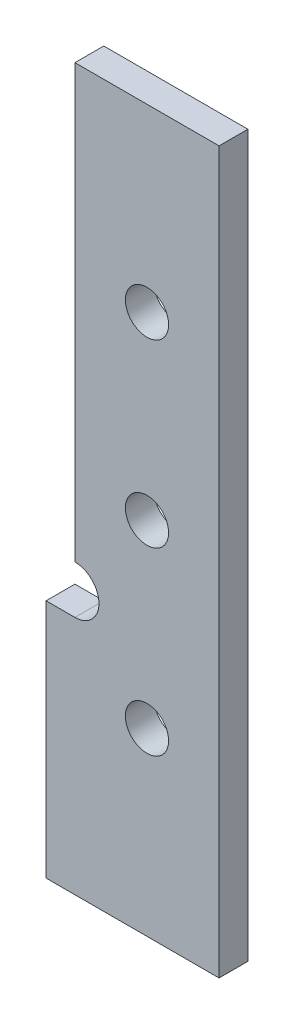
ISO-10303-21;
HEADER;
FILE_DESCRIPTION(('STEP AP214'),'2;1');
FILE_NAME('part.step','',(''),(''),'','','');
FILE_SCHEMA(('AUTOMOTIVE_DESIGN { 1 0 10303 214 1 1 1 1 }'));
ENDSEC;
DATA;
#1=APPLICATION_CONTEXT('core data for automotive mechanical design processes');
#2=APPLICATION_PROTOCOL_DEFINITION('international standard','automotive_design',2000,#1);
#3=PRODUCT_CONTEXT('',#1,'mechanical');
#4=PRODUCT('Part','Part','',(#3));
#5=PRODUCT_RELATED_PRODUCT_CATEGORY('part','',(#4));
#6=PRODUCT_DEFINITION_FORMATION('','',#4);
#7=PRODUCT_DEFINITION_CONTEXT('part definition',#1,'design');
#8=PRODUCT_DEFINITION('design','',#6,#7);
#9=PRODUCT_DEFINITION_SHAPE('','',#8);
#10=(LENGTH_UNIT() NAMED_UNIT(*) SI_UNIT(.MILLI.,.METRE.));
#11=(NAMED_UNIT(*) PLANE_ANGLE_UNIT() SI_UNIT($,.RADIAN.));
#12=(NAMED_UNIT(*) SI_UNIT($,.STERADIAN.) SOLID_ANGLE_UNIT());
#13=UNCERTAINTY_MEASURE_WITH_UNIT(LENGTH_MEASURE(1.E-05),#10,'distance_accuracy_value','');
#14=(GEOMETRIC_REPRESENTATION_CONTEXT(3) GLOBAL_UNCERTAINTY_ASSIGNED_CONTEXT((#13)) GLOBAL_UNIT_ASSIGNED_CONTEXT((#10,
#11,#12)) REPRESENTATION_CONTEXT('',''));
#15=CARTESIAN_POINT('',(0.,0.,0.));
#16=DIRECTION('',(0.,0.,1.));
#17=DIRECTION('',(1.,0.,0.));
#18=AXIS2_PLACEMENT_3D('',#15,#16,#17);
#19=CARTESIAN_POINT('',(0.,0.,6.));
#20=DIRECTION('',(1.,0.,0.));
#21=DIRECTION('',(0.,0.,-1.));
#22=AXIS2_PLACEMENT_3D('',#19,#20,#21);
#23=PLANE('',#22);
#24=DIRECTION('',(0.,-1.,0.));
#25=VECTOR('',#24,1.);
#26=CARTESIAN_POINT('',(0.,0.,0.));
#27=LINE('',#26,#25);
#28=CARTESIAN_POINT('',(0.,100.,0.));
#29=VERTEX_POINT('',#28);
#30=CARTESIAN_POINT('',(0.,10.,0.));
#31=VERTEX_POINT('',#30);
#32=EDGE_CURVE('E123',#29,#31,#27,.T.);
#33=ORIENTED_EDGE('',*,*,#32,.T.);
#34=DIRECTION('',(0.,0.,-1.));
#35=VECTOR('',#34,1.);
#36=CARTESIAN_POINT('',(0.,10.,6.));
#37=LINE('',#36,#35);
#38=CARTESIAN_POINT('',(0.,10.,6.));
#39=VERTEX_POINT('',#38);
#40=EDGE_CURVE('E47',#31,#39,#37,.F.);
#41=ORIENTED_EDGE('',*,*,#40,.T.);
#42=DIRECTION('',(0.,-1.,0.));
#43=VECTOR('',#42,1.);
#44=CARTESIAN_POINT('',(0.,0.,6.));
#45=LINE('',#44,#43);
#46=CARTESIAN_POINT('',(0.,100.,6.));
#47=VERTEX_POINT('',#46);
#48=EDGE_CURVE('E135',#47,#39,#45,.T.);
#49=ORIENTED_EDGE('',*,*,#48,.F.);
#50=DIRECTION('',(0.,0.,-1.));
#51=VECTOR('',#50,1.);
#52=CARTESIAN_POINT('',(0.,100.,6.));
#53=LINE('',#52,#51);
#54=EDGE_CURVE('E119',#47,#29,#53,.T.);
#55=ORIENTED_EDGE('',*,*,#54,.T.);
#56=EDGE_LOOP('',(#33,#41,#49,#55));
#57=FACE_BOUND('',#56,.T.);
#58=ADVANCED_FACE('F33',(#57),#23,.F.);
#59=CARTESIAN_POINT('',(-6.,0.,6.));
#60=DIRECTION('',(0.,-1.,0.));
#61=DIRECTION('',(0.,0.,-1.));
#62=AXIS2_PLACEMENT_3D('',#59,#60,#61);
#63=PLANE('',#62);
#64=DIRECTION('',(-1.,0.,0.));
#65=VECTOR('',#64,1.);
#66=CARTESIAN_POINT('',(-6.,0.,0.));
#67=LINE('',#66,#65);
#68=CARTESIAN_POINT('',(0.,0.,0.));
#69=VERTEX_POINT('',#68);
#70=CARTESIAN_POINT('',(-6.,0.,0.));
#71=VERTEX_POINT('',#70);
#72=EDGE_CURVE('E126',#69,#71,#67,.T.);
#73=ORIENTED_EDGE('',*,*,#72,.T.);
#74=DIRECTION('',(0.,0.,-1.));
#75=VECTOR('',#74,1.);
#76=CARTESIAN_POINT('',(-6.,0.,6.));
#77=LINE('',#76,#75);
#78=CARTESIAN_POINT('',(-6.,0.,6.));
#79=VERTEX_POINT('',#78);
#80=EDGE_CURVE('E40',#79,#71,#77,.T.);
#81=ORIENTED_EDGE('',*,*,#80,.F.);
#82=DIRECTION('',(-1.,0.,0.));
#83=VECTOR('',#82,1.);
#84=CARTESIAN_POINT('',(-6.,0.,6.));
#85=LINE('',#84,#83);
#86=CARTESIAN_POINT('',(0.,0.,6.));
#87=VERTEX_POINT('',#86);
#88=EDGE_CURVE('E88',#87,#79,#85,.T.);
#89=ORIENTED_EDGE('',*,*,#88,.F.);
#90=DIRECTION('',(0.,0.,-1.));
#91=VECTOR('',#90,1.);
#92=CARTESIAN_POINT('',(0.,0.,6.));
#93=LINE('',#92,#91);
#94=EDGE_CURVE('E11',#87,#69,#93,.T.);
#95=ORIENTED_EDGE('',*,*,#94,.T.);
#96=EDGE_LOOP('',(#73,#81,#89,#95));
#97=FACE_BOUND('',#96,.T.);
#98=ADVANCED_FACE('F178',(#97),#63,.F.);
#99=CARTESIAN_POINT('',(-6.,-50.,6.));
#100=DIRECTION('',(1.,0.,0.));
#101=DIRECTION('',(0.,0.,-1.));
#102=AXIS2_PLACEMENT_3D('',#99,#100,#101);
#103=PLANE('',#102);
#104=DIRECTION('',(0.,-1.,0.));
#105=VECTOR('',#104,1.);
#106=CARTESIAN_POINT('',(-6.,-50.,0.));
#107=LINE('',#106,#105);
#108=CARTESIAN_POINT('',(-6.,-50.,0.));
#109=VERTEX_POINT('',#108);
#110=EDGE_CURVE('E129',#71,#109,#107,.T.);
#111=ORIENTED_EDGE('',*,*,#110,.T.);
#112=DIRECTION('',(0.,0.,-1.));
#113=VECTOR('',#112,1.);
#114=CARTESIAN_POINT('',(-6.,-50.,6.));
#115=LINE('',#114,#113);
#116=CARTESIAN_POINT('',(-6.,-50.,6.));
#117=VERTEX_POINT('',#116);
#118=EDGE_CURVE('E114',#117,#109,#115,.T.);
#119=ORIENTED_EDGE('',*,*,#118,.F.);
#120=DIRECTION('',(0.,-1.,0.));
#121=VECTOR('',#120,1.);
#122=CARTESIAN_POINT('',(-6.,-50.,6.));
#123=LINE('',#122,#121);
#124=EDGE_CURVE('E102',#79,#117,#123,.T.);
#125=ORIENTED_EDGE('',*,*,#124,.F.);
#126=ORIENTED_EDGE('',*,*,#80,.T.);
#127=EDGE_LOOP('',(#111,#119,#125,#126));
#128=FACE_BOUND('',#127,.T.);
#129=ADVANCED_FACE('F141',(#128),#103,.F.);
#130=CARTESIAN_POINT('',(30.,-50.,6.));
#131=DIRECTION('',(0.,1.,0.));
#132=DIRECTION('',(-1.,0.,0.));
#133=AXIS2_PLACEMENT_3D('',#130,#131,#132);
#134=PLANE('',#133);
#135=DIRECTION('',(1.,0.,0.));
#136=VECTOR('',#135,1.);
#137=CARTESIAN_POINT('',(30.,-50.,0.));
#138=LINE('',#137,#136);
#139=CARTESIAN_POINT('',(30.,-50.,0.));
#140=VERTEX_POINT('',#139);
#141=EDGE_CURVE('E111',#109,#140,#138,.T.);
#142=ORIENTED_EDGE('',*,*,#141,.T.);
#143=DIRECTION('',(0.,0.,-1.));
#144=VECTOR('',#143,1.);
#145=CARTESIAN_POINT('',(30.,-50.,6.));
#146=LINE('',#145,#144);
#147=CARTESIAN_POINT('',(30.,-50.,6.));
#148=VERTEX_POINT('',#147);
#149=EDGE_CURVE('E108',#148,#140,#146,.T.);
#150=ORIENTED_EDGE('',*,*,#149,.F.);
#151=DIRECTION('',(1.,0.,0.));
#152=VECTOR('',#151,1.);
#153=CARTESIAN_POINT('',(30.,-50.,6.));
#154=LINE('',#153,#152);
#155=EDGE_CURVE('E95',#117,#148,#154,.T.);
#156=ORIENTED_EDGE('',*,*,#155,.F.);
#157=ORIENTED_EDGE('',*,*,#118,.T.);
#158=EDGE_LOOP('',(#142,#150,#156,#157));
#159=FACE_BOUND('',#158,.T.);
#160=ADVANCED_FACE('F109',(#159),#134,.F.);
#161=CARTESIAN_POINT('',(30.,100.,6.));
#162=DIRECTION('',(-1.,0.,0.));
#163=DIRECTION('',(0.,-1.,0.));
#164=AXIS2_PLACEMENT_3D('',#161,#162,#163);
#165=PLANE('',#164);
#166=DIRECTION('',(0.,1.,0.));
#167=VECTOR('',#166,1.);
#168=CARTESIAN_POINT('',(30.,100.,0.));
#169=LINE('',#168,#167);
#170=CARTESIAN_POINT('',(30.,100.,0.));
#171=VERTEX_POINT('',#170);
#172=EDGE_CURVE('E132',#140,#171,#169,.T.);
#173=ORIENTED_EDGE('',*,*,#172,.T.);
#174=DIRECTION('',(0.,0.,-1.));
#175=VECTOR('',#174,1.);
#176=CARTESIAN_POINT('',(30.,100.,6.));
#177=LINE('',#176,#175);
#178=CARTESIAN_POINT('',(30.,100.,6.));
#179=VERTEX_POINT('',#178);
#180=EDGE_CURVE('E115',#179,#171,#177,.T.);
#181=ORIENTED_EDGE('',*,*,#180,.F.);
#182=DIRECTION('',(0.,1.,0.));
#183=VECTOR('',#182,1.);
#184=CARTESIAN_POINT('',(30.,100.,6.));
#185=LINE('',#184,#183);
#186=EDGE_CURVE('E99',#148,#179,#185,.T.);
#187=ORIENTED_EDGE('',*,*,#186,.F.);
#188=ORIENTED_EDGE('',*,*,#149,.T.);
#189=EDGE_LOOP('',(#173,#181,#187,#188));
#190=FACE_BOUND('',#189,.T.);
#191=ADVANCED_FACE('F117',(#190),#165,.F.);
#192=CARTESIAN_POINT('',(0.,100.,6.));
#193=DIRECTION('',(0.,-1.,0.));
#194=DIRECTION('',(0.,0.,-1.));
#195=AXIS2_PLACEMENT_3D('',#192,#193,#194);
#196=PLANE('',#195);
#197=DIRECTION('',(-1.,0.,0.));
#198=VECTOR('',#197,1.);
#199=CARTESIAN_POINT('',(0.,100.,0.));
#200=LINE('',#199,#198);
#201=EDGE_CURVE('E80',#171,#29,#200,.T.);
#202=ORIENTED_EDGE('',*,*,#201,.T.);
#203=ORIENTED_EDGE('',*,*,#54,.F.);
#204=DIRECTION('',(-1.,0.,0.));
#205=VECTOR('',#204,1.);
#206=CARTESIAN_POINT('',(0.,100.,6.));
#207=LINE('',#206,#205);
#208=EDGE_CURVE('E56',#179,#47,#207,.T.);
#209=ORIENTED_EDGE('',*,*,#208,.F.);
#210=ORIENTED_EDGE('',*,*,#180,.T.);
#211=EDGE_LOOP('',(#202,#203,#209,#210));
#212=FACE_BOUND('',#211,.T.);
#213=ADVANCED_FACE('F148',(#212),#196,.F.);
#214=CARTESIAN_POINT('',(0.,0.,6.));
#215=DIRECTION('',(0.,0.,-1.));
#216=DIRECTION('',(-1.,0.,0.));
#217=AXIS2_PLACEMENT_3D('',#214,#215,#216);
#218=PLANE('',#217);
#219=CARTESIAN_POINT('',(15.,62.5,6.));
#220=DIRECTION('',(0.,0.,1.));
#221=DIRECTION('',(1.,0.,0.));
#222=AXIS2_PLACEMENT_3D('',#219,#220,#221);
#223=CIRCLE('',#222,4.5);
#224=CARTESIAN_POINT('',(19.5,62.5,6.));
#225=VERTEX_POINT('',#224);
#226=EDGE_CURVE('E169',#225,#225,#223,.T.);
#227=ORIENTED_EDGE('',*,*,#226,.F.);
#228=EDGE_LOOP('',(#227));
#229=FACE_BOUND('',#228,.T.);
#230=CARTESIAN_POINT('',(15.,25.,6.));
#231=DIRECTION('',(0.,0.,1.));
#232=DIRECTION('',(1.,0.,0.));
#233=AXIS2_PLACEMENT_3D('',#230,#231,#232);
#234=CIRCLE('',#233,4.5);
#235=CARTESIAN_POINT('',(19.5,25.,6.));
#236=VERTEX_POINT('',#235);
#237=EDGE_CURVE('E163',#236,#236,#234,.T.);
#238=ORIENTED_EDGE('',*,*,#237,.F.);
#239=EDGE_LOOP('',(#238));
#240=FACE_BOUND('',#239,.T.);
#241=CARTESIAN_POINT('',(15.,-12.5,6.));
#242=DIRECTION('',(0.,0.,1.));
#243=DIRECTION('',(1.,0.,0.));
#244=AXIS2_PLACEMENT_3D('',#241,#242,#243);
#245=CIRCLE('',#244,4.5);
#246=CARTESIAN_POINT('',(19.5,-12.5,6.));
#247=VERTEX_POINT('',#246);
#248=EDGE_CURVE('E157',#247,#247,#245,.T.);
#249=ORIENTED_EDGE('',*,*,#248,.F.);
#250=EDGE_LOOP('',(#249));
#251=FACE_BOUND('',#250,.T.);
#252=ORIENTED_EDGE('',*,*,#48,.T.);
#253=CARTESIAN_POINT('',(0.,5.,6.));
#254=DIRECTION('',(0.,0.,-1.));
#255=DIRECTION('',(-1.,0.,0.));
#256=AXIS2_PLACEMENT_3D('',#253,#254,#255);
#257=CIRCLE('',#256,5.);
#258=EDGE_CURVE('E173',#39,#87,#257,.T.);
#259=ORIENTED_EDGE('',*,*,#258,.T.);
#260=ORIENTED_EDGE('',*,*,#88,.T.);
#261=ORIENTED_EDGE('',*,*,#124,.T.);
#262=ORIENTED_EDGE('',*,*,#155,.T.);
#263=ORIENTED_EDGE('',*,*,#186,.T.);
#264=ORIENTED_EDGE('',*,*,#208,.T.);
#265=EDGE_LOOP('',(#252,#259,#260,#261,#262,#263,#264));
#266=FACE_BOUND('',#265,.T.);
#267=ADVANCED_FACE('F97',(#229,#240,#251,#266),#218,.F.);
#268=CARTESIAN_POINT('',(0.,0.,0.));
#269=DIRECTION('',(0.,0.,-1.));
#270=DIRECTION('',(-1.,0.,0.));
#271=AXIS2_PLACEMENT_3D('',#268,#269,#270);
#272=PLANE('',#271);
#273=CARTESIAN_POINT('',(0.,5.,0.));
#274=DIRECTION('',(0.,0.,-1.));
#275=DIRECTION('',(-1.,0.,0.));
#276=AXIS2_PLACEMENT_3D('',#273,#274,#275);
#277=CIRCLE('',#276,5.);
#278=EDGE_CURVE('E174',#31,#69,#277,.T.);
#279=ORIENTED_EDGE('',*,*,#278,.F.);
#280=ORIENTED_EDGE('',*,*,#32,.F.);
#281=ORIENTED_EDGE('',*,*,#201,.F.);
#282=ORIENTED_EDGE('',*,*,#172,.F.);
#283=ORIENTED_EDGE('',*,*,#141,.F.);
#284=ORIENTED_EDGE('',*,*,#110,.F.);
#285=ORIENTED_EDGE('',*,*,#72,.F.);
#286=EDGE_LOOP('',(#279,#280,#281,#282,#283,#284,#285));
#287=FACE_BOUND('',#286,.T.);
#288=CARTESIAN_POINT('',(15.,62.5,0.));
#289=DIRECTION('',(0.,0.,1.));
#290=DIRECTION('',(1.,0.,0.));
#291=AXIS2_PLACEMENT_3D('',#288,#289,#290);
#292=CIRCLE('',#291,4.5);
#293=CARTESIAN_POINT('',(19.5,62.5,0.));
#294=VERTEX_POINT('',#293);
#295=EDGE_CURVE('E166',#294,#294,#292,.T.);
#296=ORIENTED_EDGE('',*,*,#295,.T.);
#297=EDGE_LOOP('',(#296));
#298=FACE_BOUND('',#297,.T.);
#299=CARTESIAN_POINT('',(15.,25.,0.));
#300=DIRECTION('',(0.,0.,1.));
#301=DIRECTION('',(1.,0.,0.));
#302=AXIS2_PLACEMENT_3D('',#299,#300,#301);
#303=CIRCLE('',#302,4.5);
#304=CARTESIAN_POINT('',(19.5,25.,0.));
#305=VERTEX_POINT('',#304);
#306=EDGE_CURVE('E160',#305,#305,#303,.T.);
#307=ORIENTED_EDGE('',*,*,#306,.T.);
#308=EDGE_LOOP('',(#307));
#309=FACE_BOUND('',#308,.T.);
#310=CARTESIAN_POINT('',(15.,-12.5,0.));
#311=DIRECTION('',(0.,0.,1.));
#312=DIRECTION('',(1.,0.,0.));
#313=AXIS2_PLACEMENT_3D('',#310,#311,#312);
#314=CIRCLE('',#313,4.5);
#315=CARTESIAN_POINT('',(19.5,-12.5,0.));
#316=VERTEX_POINT('',#315);
#317=EDGE_CURVE('E127',#316,#316,#314,.T.);
#318=ORIENTED_EDGE('',*,*,#317,.T.);
#319=EDGE_LOOP('',(#318));
#320=FACE_BOUND('',#319,.T.);
#321=ADVANCED_FACE('F145',(#287,#298,#309,#320),#272,.T.);
#322=CARTESIAN_POINT('',(15.,-12.5,6.));
#323=DIRECTION('',(0.,0.,1.));
#324=DIRECTION('',(1.,0.,0.));
#325=AXIS2_PLACEMENT_3D('',#322,#323,#324);
#326=CYLINDRICAL_SURFACE('',#325,4.5);
#327=ORIENTED_EDGE('',*,*,#317,.F.);
#328=EDGE_LOOP('',(#327));
#329=FACE_BOUND('',#328,.T.);
#330=ORIENTED_EDGE('',*,*,#248,.T.);
#331=EDGE_LOOP('',(#330));
#332=FACE_BOUND('',#331,.T.);
#333=ADVANCED_FACE('F208',(#329,#332),#326,.F.);
#334=CARTESIAN_POINT('',(15.,25.,6.));
#335=DIRECTION('',(0.,0.,1.));
#336=DIRECTION('',(1.,0.,0.));
#337=AXIS2_PLACEMENT_3D('',#334,#335,#336);
#338=CYLINDRICAL_SURFACE('',#337,4.5);
#339=ORIENTED_EDGE('',*,*,#306,.F.);
#340=EDGE_LOOP('',(#339));
#341=FACE_BOUND('',#340,.T.);
#342=ORIENTED_EDGE('',*,*,#237,.T.);
#343=EDGE_LOOP('',(#342));
#344=FACE_BOUND('',#343,.T.);
#345=ADVANCED_FACE('F186',(#341,#344),#338,.F.);
#346=CARTESIAN_POINT('',(15.,62.5,6.));
#347=DIRECTION('',(0.,0.,1.));
#348=DIRECTION('',(1.,0.,0.));
#349=AXIS2_PLACEMENT_3D('',#346,#347,#348);
#350=CYLINDRICAL_SURFACE('',#349,4.5);
#351=ORIENTED_EDGE('',*,*,#295,.F.);
#352=EDGE_LOOP('',(#351));
#353=FACE_BOUND('',#352,.T.);
#354=ORIENTED_EDGE('',*,*,#226,.T.);
#355=EDGE_LOOP('',(#354));
#356=FACE_BOUND('',#355,.T.);
#357=ADVANCED_FACE('F181',(#353,#356),#350,.F.);
#358=CARTESIAN_POINT('',(0.,5.,6.));
#359=DIRECTION('',(0.,0.,-1.));
#360=DIRECTION('',(-1.,0.,0.));
#361=AXIS2_PLACEMENT_3D('',#358,#359,#360);
#362=CYLINDRICAL_SURFACE('',#361,5.);
#363=ORIENTED_EDGE('',*,*,#278,.T.);
#364=ORIENTED_EDGE('',*,*,#94,.F.);
#365=ORIENTED_EDGE('',*,*,#258,.F.);
#366=ORIENTED_EDGE('',*,*,#40,.F.);
#367=EDGE_LOOP('',(#363,#364,#365,#366));
#368=FACE_BOUND('',#367,.T.);
#369=ADVANCED_FACE('F179',(#368),#362,.F.);
#370=CLOSED_SHELL('',(#58,#98,#129,#160,#191,#213,#267,#321,#333,#345,#357,#369));
#371=MANIFOLD_SOLID_BREP('B2',#370);
#372=ADVANCED_BREP_SHAPE_REPRESENTATION('',(#18,#371),#14);
#373=SHAPE_DEFINITION_REPRESENTATION(#9,#372);
ENDSEC;
END-ISO-10303-21;
